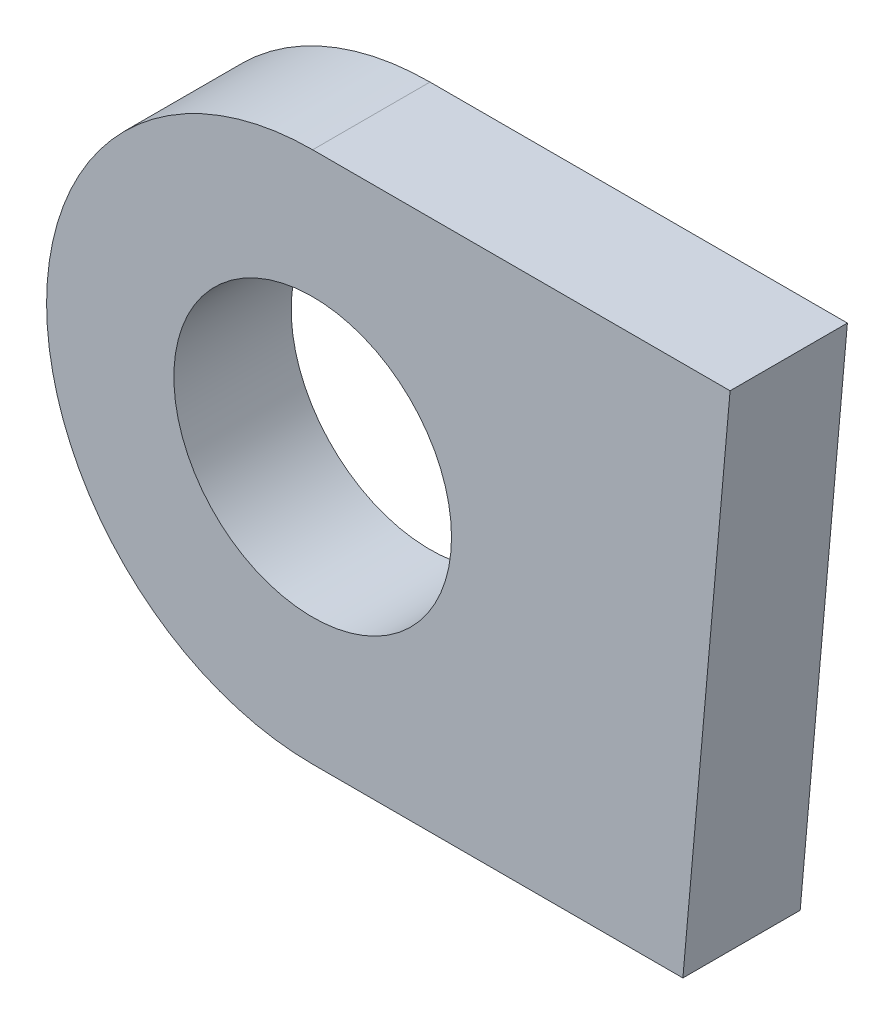
ISO-10303-21;
HEADER;
FILE_DESCRIPTION(('STEP AP214'),'2;1');
FILE_NAME('part.step','',(''),(''),'','','');
FILE_SCHEMA(('AUTOMOTIVE_DESIGN { 1 0 10303 214 1 1 1 1 }'));
ENDSEC;
DATA;
#1=APPLICATION_CONTEXT('core data for automotive mechanical design processes');
#2=APPLICATION_PROTOCOL_DEFINITION('international standard','automotive_design',2000,#1);
#3=PRODUCT_CONTEXT('',#1,'mechanical');
#4=PRODUCT('Part','Part','',(#3));
#5=PRODUCT_RELATED_PRODUCT_CATEGORY('part','',(#4));
#6=PRODUCT_DEFINITION_FORMATION('','',#4);
#7=PRODUCT_DEFINITION_CONTEXT('part definition',#1,'design');
#8=PRODUCT_DEFINITION('design','',#6,#7);
#9=PRODUCT_DEFINITION_SHAPE('','',#8);
#10=(LENGTH_UNIT() NAMED_UNIT(*) SI_UNIT(.MILLI.,.METRE.));
#11=(NAMED_UNIT(*) PLANE_ANGLE_UNIT() SI_UNIT($,.RADIAN.));
#12=(NAMED_UNIT(*) SI_UNIT($,.STERADIAN.) SOLID_ANGLE_UNIT());
#13=UNCERTAINTY_MEASURE_WITH_UNIT(LENGTH_MEASURE(1.E-05),#10,'distance_accuracy_value','');
#14=(GEOMETRIC_REPRESENTATION_CONTEXT(3) GLOBAL_UNCERTAINTY_ASSIGNED_CONTEXT((#13)) GLOBAL_UNIT_ASSIGNED_CONTEXT((#10,
#11,#12)) REPRESENTATION_CONTEXT('',''));
#15=CARTESIAN_POINT('',(0.,0.,0.));
#16=DIRECTION('',(0.,0.,1.));
#17=DIRECTION('',(1.,0.,0.));
#18=AXIS2_PLACEMENT_3D('',#15,#16,#17);
#19=CARTESIAN_POINT('',(0.,-11.5,2.535));
#20=DIRECTION('',(0.,1.,0.));
#21=DIRECTION('',(-1.,0.,0.));
#22=AXIS2_PLACEMENT_3D('',#19,#20,#21);
#23=PLANE('',#22);
#24=DIRECTION('',(1.,0.,0.));
#25=VECTOR('',#24,1.);
#26=CARTESIAN_POINT('',(0.,-11.5,-2.535));
#27=LINE('',#26,#25);
#28=CARTESIAN_POINT('',(0.,-11.5,-2.535));
#29=VERTEX_POINT('',#28);
#30=CARTESIAN_POINT('',(16.,-11.5,-2.535));
#31=VERTEX_POINT('',#30);
#32=EDGE_CURVE('E107',#29,#31,#27,.T.);
#33=ORIENTED_EDGE('',*,*,#32,.T.);
#34=DIRECTION('',(0.,0.,-1.));
#35=VECTOR('',#34,1.);
#36=CARTESIAN_POINT('',(16.,-11.5,2.535));
#37=LINE('',#36,#35);
#38=CARTESIAN_POINT('',(16.,-11.5,2.535));
#39=VERTEX_POINT('',#38);
#40=EDGE_CURVE('E11',#39,#31,#37,.T.);
#41=ORIENTED_EDGE('',*,*,#40,.F.);
#42=DIRECTION('',(1.,0.,0.));
#43=VECTOR('',#42,1.);
#44=CARTESIAN_POINT('',(0.,-11.5,2.535));
#45=LINE('',#44,#43);
#46=CARTESIAN_POINT('',(0.,-11.5,2.535));
#47=VERTEX_POINT('',#46);
#48=EDGE_CURVE('E89',#47,#39,#45,.T.);
#49=ORIENTED_EDGE('',*,*,#48,.F.);
#50=DIRECTION('',(0.,0.,-1.));
#51=VECTOR('',#50,1.);
#52=CARTESIAN_POINT('',(0.,-11.5,2.535));
#53=LINE('',#52,#51);
#54=EDGE_CURVE('E106',#47,#29,#53,.T.);
#55=ORIENTED_EDGE('',*,*,#54,.T.);
#56=EDGE_LOOP('',(#33,#41,#49,#55));
#57=FACE_BOUND('',#56,.T.);
#58=ADVANCED_FACE('F41',(#57),#23,.F.);
#59=CARTESIAN_POINT('',(16.8873545660034,-1.49824403121041,2.535));
#60=DIRECTION('',(-0.996087473818487,0.088372758822532,0.));
#61=DIRECTION('',(-0.088372758822532,-0.996087473818487,0.));
#62=AXIS2_PLACEMENT_3D('',#59,#60,#61);
#63=PLANE('',#62);
#64=DIRECTION('',(0.088372758822532,0.996087473818487,0.));
#65=VECTOR('',#64,1.);
#66=CARTESIAN_POINT('',(16.8873545660034,-1.49824403121041,-2.535));
#67=LINE('',#66,#65);
#68=CARTESIAN_POINT('',(18.0405571863346,11.5,-2.535));
#69=VERTEX_POINT('',#68);
#70=EDGE_CURVE('E94',#31,#69,#67,.T.);
#71=ORIENTED_EDGE('',*,*,#70,.T.);
#72=DIRECTION('',(0.,0.,-1.));
#73=VECTOR('',#72,1.);
#74=CARTESIAN_POINT('',(18.0405571863346,11.5,2.535));
#75=LINE('',#74,#73);
#76=CARTESIAN_POINT('',(18.0405571863346,11.5,2.535));
#77=VERTEX_POINT('',#76);
#78=EDGE_CURVE('E49',#77,#69,#75,.T.);
#79=ORIENTED_EDGE('',*,*,#78,.F.);
#80=DIRECTION('',(0.088372758822532,0.996087473818487,0.));
#81=VECTOR('',#80,1.);
#82=CARTESIAN_POINT('',(16.8873545660034,-1.49824403121041,2.535));
#83=LINE('',#82,#81);
#84=EDGE_CURVE('E83',#39,#77,#83,.T.);
#85=ORIENTED_EDGE('',*,*,#84,.F.);
#86=ORIENTED_EDGE('',*,*,#40,.T.);
#87=EDGE_LOOP('',(#71,#79,#85,#86));
#88=FACE_BOUND('',#87,.T.);
#89=ADVANCED_FACE('F93',(#88),#63,.F.);
#90=CARTESIAN_POINT('',(0.,11.5,2.535));
#91=DIRECTION('',(0.,1.,0.));
#92=DIRECTION('',(-1.,0.,0.));
#93=AXIS2_PLACEMENT_3D('',#90,#91,#92);
#94=PLANE('',#93);
#95=DIRECTION('',(1.,0.,0.));
#96=VECTOR('',#95,1.);
#97=CARTESIAN_POINT('',(0.,11.5,-2.535));
#98=LINE('',#97,#96);
#99=CARTESIAN_POINT('',(0.,11.5,-2.535));
#100=VERTEX_POINT('',#99);
#101=EDGE_CURVE('E111',#100,#69,#98,.T.);
#102=ORIENTED_EDGE('',*,*,#101,.F.);
#103=DIRECTION('',(0.,0.,-1.));
#104=VECTOR('',#103,1.);
#105=CARTESIAN_POINT('',(0.,11.5,2.535));
#106=LINE('',#105,#104);
#107=CARTESIAN_POINT('',(0.,11.5,2.535));
#108=VERTEX_POINT('',#107);
#109=EDGE_CURVE('E73',#108,#100,#106,.T.);
#110=ORIENTED_EDGE('',*,*,#109,.F.);
#111=DIRECTION('',(1.,0.,0.));
#112=VECTOR('',#111,1.);
#113=CARTESIAN_POINT('',(0.,11.5,2.535));
#114=LINE('',#113,#112);
#115=EDGE_CURVE('E87',#108,#77,#114,.T.);
#116=ORIENTED_EDGE('',*,*,#115,.T.);
#117=ORIENTED_EDGE('',*,*,#78,.T.);
#118=EDGE_LOOP('',(#102,#110,#116,#117));
#119=FACE_BOUND('',#118,.T.);
#120=ADVANCED_FACE('F98',(#119),#94,.T.);
#121=CARTESIAN_POINT('',(0.,0.,2.535));
#122=DIRECTION('',(0.,0.,-1.));
#123=DIRECTION('',(-1.,0.,0.));
#124=AXIS2_PLACEMENT_3D('',#121,#122,#123);
#125=CYLINDRICAL_SURFACE('',#124,11.5);
#126=CARTESIAN_POINT('',(0.,0.,-2.535));
#127=DIRECTION('',(0.,0.,1.));
#128=DIRECTION('',(1.,0.,0.));
#129=AXIS2_PLACEMENT_3D('',#126,#127,#128);
#130=CIRCLE('',#129,11.5);
#131=EDGE_CURVE('E76',#100,#29,#130,.T.);
#132=ORIENTED_EDGE('',*,*,#131,.T.);
#133=ORIENTED_EDGE('',*,*,#54,.F.);
#134=CARTESIAN_POINT('',(0.,0.,2.535));
#135=DIRECTION('',(0.,0.,1.));
#136=DIRECTION('',(1.,0.,0.));
#137=AXIS2_PLACEMENT_3D('',#134,#135,#136);
#138=CIRCLE('',#137,11.5);
#139=EDGE_CURVE('E57',#108,#47,#138,.T.);
#140=ORIENTED_EDGE('',*,*,#139,.F.);
#141=ORIENTED_EDGE('',*,*,#109,.T.);
#142=EDGE_LOOP('',(#132,#133,#140,#141));
#143=FACE_BOUND('',#142,.T.);
#144=ADVANCED_FACE('F129',(#143),#125,.T.);
#145=CARTESIAN_POINT('',(0.,0.,2.535));
#146=DIRECTION('',(0.,0.,-1.));
#147=DIRECTION('',(-1.,0.,0.));
#148=AXIS2_PLACEMENT_3D('',#145,#146,#147);
#149=CYLINDRICAL_SURFACE('',#148,6.);
#150=CARTESIAN_POINT('',(0.,0.,2.535));
#151=DIRECTION('',(0.,0.,1.));
#152=DIRECTION('',(1.,0.,0.));
#153=AXIS2_PLACEMENT_3D('',#150,#151,#152);
#154=CIRCLE('',#153,6.);
#155=CARTESIAN_POINT('',(6.,0.,2.535));
#156=VERTEX_POINT('',#155);
#157=EDGE_CURVE('E100',#156,#156,#154,.T.);
#158=ORIENTED_EDGE('',*,*,#157,.T.);
#159=EDGE_LOOP('',(#158));
#160=FACE_BOUND('',#159,.T.);
#161=CARTESIAN_POINT('',(0.,0.,-2.535));
#162=DIRECTION('',(0.,0.,1.));
#163=DIRECTION('',(1.,0.,0.));
#164=AXIS2_PLACEMENT_3D('',#161,#162,#163);
#165=CIRCLE('',#164,6.);
#166=CARTESIAN_POINT('',(6.,0.,-2.535));
#167=VERTEX_POINT('',#166);
#168=EDGE_CURVE('E114',#167,#167,#165,.T.);
#169=ORIENTED_EDGE('',*,*,#168,.F.);
#170=EDGE_LOOP('',(#169));
#171=FACE_BOUND('',#170,.T.);
#172=ADVANCED_FACE('F127',(#160,#171),#149,.F.);
#173=CARTESIAN_POINT('',(0.,0.,2.535));
#174=DIRECTION('',(0.,0.,1.));
#175=DIRECTION('',(1.,0.,0.));
#176=AXIS2_PLACEMENT_3D('',#173,#174,#175);
#177=PLANE('',#176);
#178=ORIENTED_EDGE('',*,*,#48,.T.);
#179=ORIENTED_EDGE('',*,*,#84,.T.);
#180=ORIENTED_EDGE('',*,*,#115,.F.);
#181=ORIENTED_EDGE('',*,*,#139,.T.);
#182=EDGE_LOOP('',(#178,#179,#180,#181));
#183=FACE_BOUND('',#182,.T.);
#184=ORIENTED_EDGE('',*,*,#157,.F.);
#185=EDGE_LOOP('',(#184));
#186=FACE_BOUND('',#185,.T.);
#187=ADVANCED_FACE('F84',(#183,#186),#177,.T.);
#188=CARTESIAN_POINT('',(0.,0.,-2.535));
#189=DIRECTION('',(0.,0.,1.));
#190=DIRECTION('',(1.,0.,0.));
#191=AXIS2_PLACEMENT_3D('',#188,#189,#190);
#192=PLANE('',#191);
#193=ORIENTED_EDGE('',*,*,#32,.F.);
#194=ORIENTED_EDGE('',*,*,#131,.F.);
#195=ORIENTED_EDGE('',*,*,#101,.T.);
#196=ORIENTED_EDGE('',*,*,#70,.F.);
#197=EDGE_LOOP('',(#193,#194,#195,#196));
#198=FACE_BOUND('',#197,.T.);
#199=ORIENTED_EDGE('',*,*,#168,.T.);
#200=EDGE_LOOP('',(#199));
#201=FACE_BOUND('',#200,.T.);
#202=ADVANCED_FACE('F121',(#198,#201),#192,.F.);
#203=CLOSED_SHELL('',(#58,#89,#120,#144,#172,#187,#202));
#204=MANIFOLD_SOLID_BREP('B2',#203);
#205=ADVANCED_BREP_SHAPE_REPRESENTATION('',(#18,#204),#14);
#206=SHAPE_DEFINITION_REPRESENTATION(#9,#205);
ENDSEC;
END-ISO-10303-21;
